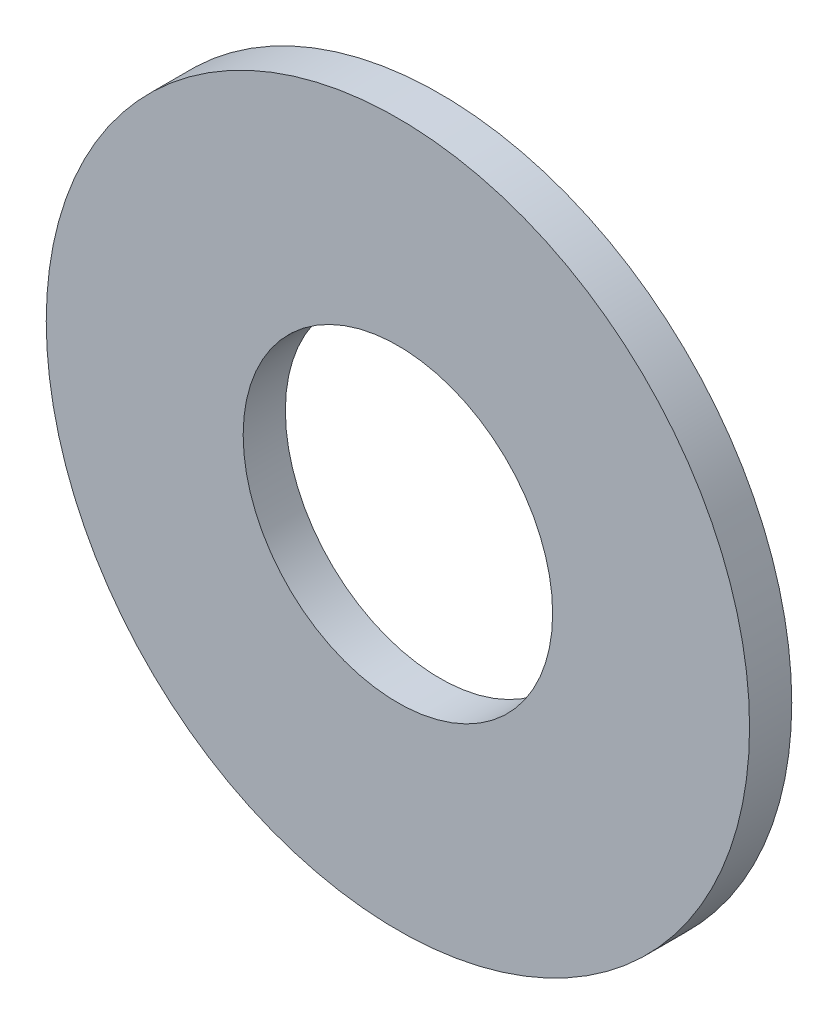
ISO-10303-21;
HEADER;
FILE_DESCRIPTION(('STEP AP214'),'2;1');
FILE_NAME('part.step','',(''),(''),'','','');
FILE_SCHEMA(('AUTOMOTIVE_DESIGN { 1 0 10303 214 1 1 1 1 }'));
ENDSEC;
DATA;
#1=APPLICATION_CONTEXT('core data for automotive mechanical design processes');
#2=APPLICATION_PROTOCOL_DEFINITION('international standard','automotive_design',2000,#1);
#3=PRODUCT_CONTEXT('',#1,'mechanical');
#4=PRODUCT('Part','Part','',(#3));
#5=PRODUCT_RELATED_PRODUCT_CATEGORY('part','',(#4));
#6=PRODUCT_DEFINITION_FORMATION('','',#4);
#7=PRODUCT_DEFINITION_CONTEXT('part definition',#1,'design');
#8=PRODUCT_DEFINITION('design','',#6,#7);
#9=PRODUCT_DEFINITION_SHAPE('','',#8);
#10=(LENGTH_UNIT() NAMED_UNIT(*) SI_UNIT(.MILLI.,.METRE.));
#11=(NAMED_UNIT(*) PLANE_ANGLE_UNIT() SI_UNIT($,.RADIAN.));
#12=(NAMED_UNIT(*) SI_UNIT($,.STERADIAN.) SOLID_ANGLE_UNIT());
#13=UNCERTAINTY_MEASURE_WITH_UNIT(LENGTH_MEASURE(1.E-05),#10,'distance_accuracy_value','');
#14=(GEOMETRIC_REPRESENTATION_CONTEXT(3) GLOBAL_UNCERTAINTY_ASSIGNED_CONTEXT((#13)) GLOBAL_UNIT_ASSIGNED_CONTEXT((#10,
#11,#12)) REPRESENTATION_CONTEXT('',''));
#15=CARTESIAN_POINT('',(0.,0.,0.));
#16=DIRECTION('',(0.,0.,1.));
#17=DIRECTION('',(1.,0.,0.));
#18=AXIS2_PLACEMENT_3D('',#15,#16,#17);
#19=CARTESIAN_POINT('',(0.,0.,0.3));
#20=DIRECTION('',(0.,0.,1.));
#21=DIRECTION('',(1.,0.,0.));
#22=AXIS2_PLACEMENT_3D('',#19,#20,#21);
#23=PLANE('',#22);
#24=CARTESIAN_POINT('',(0.,0.,0.3));
#25=DIRECTION('',(0.,0.,1.));
#26=DIRECTION('',(1.,0.,0.));
#27=AXIS2_PLACEMENT_3D('',#24,#25,#26);
#28=CIRCLE('',#27,2.5);
#29=CARTESIAN_POINT('',(2.5,0.,0.3));
#30=VERTEX_POINT('',#29);
#31=EDGE_CURVE('E10',#30,#30,#28,.T.);
#32=ORIENTED_EDGE('',*,*,#31,.T.);
#33=EDGE_LOOP('',(#32));
#34=FACE_BOUND('',#33,.T.);
#35=CARTESIAN_POINT('',(0.,0.,0.3));
#36=DIRECTION('',(0.,0.,1.));
#37=DIRECTION('',(1.,0.,0.));
#38=AXIS2_PLACEMENT_3D('',#35,#36,#37);
#39=CIRCLE('',#38,1.1);
#40=CARTESIAN_POINT('',(1.1,0.,0.3));
#41=VERTEX_POINT('',#40);
#42=EDGE_CURVE('E49',#41,#41,#39,.T.);
#43=ORIENTED_EDGE('',*,*,#42,.F.);
#44=EDGE_LOOP('',(#43));
#45=FACE_BOUND('',#44,.T.);
#46=ADVANCED_FACE('F39',(#34,#45),#23,.T.);
#47=CARTESIAN_POINT('',(0.,0.,0.));
#48=DIRECTION('',(0.,0.,1.));
#49=DIRECTION('',(1.,0.,0.));
#50=AXIS2_PLACEMENT_3D('',#47,#48,#49);
#51=PLANE('',#50);
#52=CARTESIAN_POINT('',(0.,0.,0.));
#53=DIRECTION('',(0.,0.,1.));
#54=DIRECTION('',(1.,0.,0.));
#55=AXIS2_PLACEMENT_3D('',#52,#53,#54);
#56=CIRCLE('',#55,2.5);
#57=CARTESIAN_POINT('',(2.5,0.,0.));
#58=VERTEX_POINT('',#57);
#59=EDGE_CURVE('E43',#58,#58,#56,.T.);
#60=ORIENTED_EDGE('',*,*,#59,.F.);
#61=EDGE_LOOP('',(#60));
#62=FACE_BOUND('',#61,.T.);
#63=CARTESIAN_POINT('',(0.,0.,0.));
#64=DIRECTION('',(0.,0.,1.));
#65=DIRECTION('',(1.,0.,0.));
#66=AXIS2_PLACEMENT_3D('',#63,#64,#65);
#67=CIRCLE('',#66,1.1);
#68=CARTESIAN_POINT('',(1.1,0.,0.));
#69=VERTEX_POINT('',#68);
#70=EDGE_CURVE('E55',#69,#69,#67,.T.);
#71=ORIENTED_EDGE('',*,*,#70,.T.);
#72=EDGE_LOOP('',(#71));
#73=FACE_BOUND('',#72,.T.);
#74=ADVANCED_FACE('F65',(#62,#73),#51,.F.);
#75=CARTESIAN_POINT('',(0.,0.,0.3));
#76=DIRECTION('',(0.,0.,-1.));
#77=DIRECTION('',(-1.,0.,0.));
#78=AXIS2_PLACEMENT_3D('',#75,#76,#77);
#79=CYLINDRICAL_SURFACE('',#78,2.5);
#80=ORIENTED_EDGE('',*,*,#31,.F.);
#81=EDGE_LOOP('',(#80));
#82=FACE_BOUND('',#81,.T.);
#83=ORIENTED_EDGE('',*,*,#59,.T.);
#84=EDGE_LOOP('',(#83));
#85=FACE_BOUND('',#84,.T.);
#86=ADVANCED_FACE('F41',(#82,#85),#79,.T.);
#87=CARTESIAN_POINT('',(0.,0.,0.3));
#88=DIRECTION('',(0.,0.,-1.));
#89=DIRECTION('',(-1.,0.,0.));
#90=AXIS2_PLACEMENT_3D('',#87,#88,#89);
#91=CYLINDRICAL_SURFACE('',#90,1.1);
#92=ORIENTED_EDGE('',*,*,#42,.T.);
#93=EDGE_LOOP('',(#92));
#94=FACE_BOUND('',#93,.T.);
#95=ORIENTED_EDGE('',*,*,#70,.F.);
#96=EDGE_LOOP('',(#95));
#97=FACE_BOUND('',#96,.T.);
#98=ADVANCED_FACE('F59',(#94,#97),#91,.F.);
#99=CLOSED_SHELL('',(#46,#74,#86,#98));
#100=MANIFOLD_SOLID_BREP('B2',#99);
#101=ADVANCED_BREP_SHAPE_REPRESENTATION('',(#18,#100),#14);
#102=SHAPE_DEFINITION_REPRESENTATION(#9,#101);
ENDSEC;
END-ISO-10303-21;
